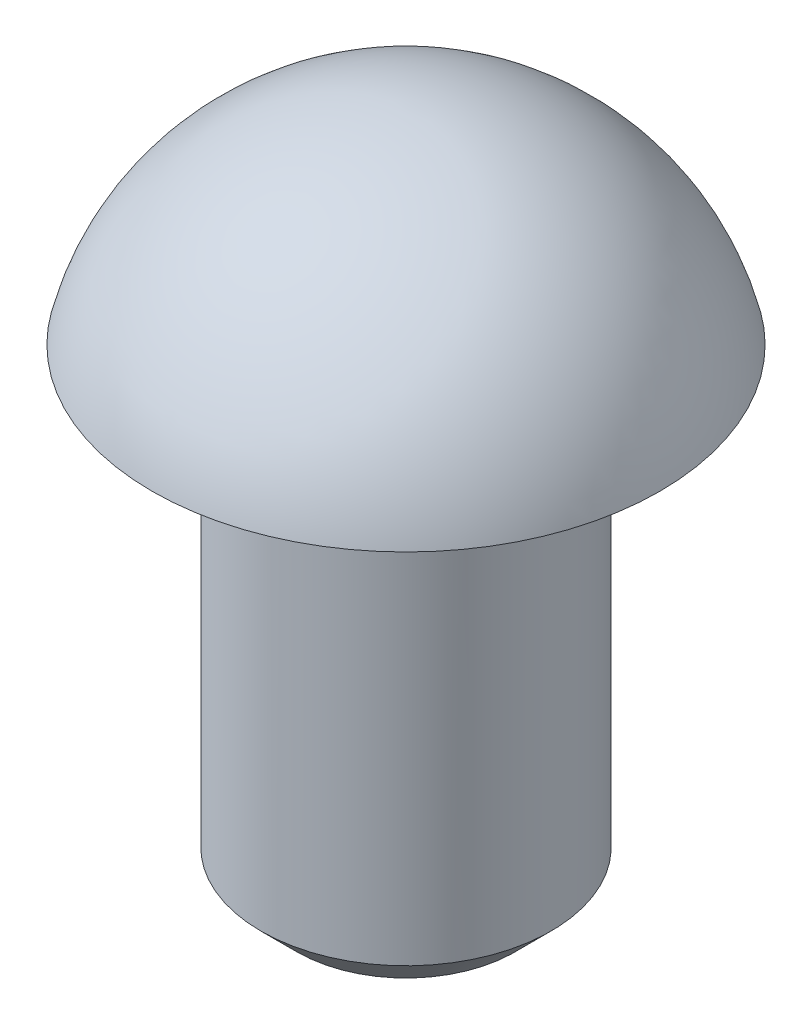
ISO-10303-21;
HEADER;
FILE_DESCRIPTION(('STEP AP214'),'2;1');
FILE_NAME('part.step','',(''),(''),'','','');
FILE_SCHEMA(('AUTOMOTIVE_DESIGN { 1 0 10303 214 1 1 1 1 }'));
ENDSEC;
DATA;
#1=APPLICATION_CONTEXT('core data for automotive mechanical design processes');
#2=APPLICATION_PROTOCOL_DEFINITION('international standard','automotive_design',2000,#1);
#3=PRODUCT_CONTEXT('',#1,'mechanical');
#4=PRODUCT('Part','Part','',(#3));
#5=PRODUCT_RELATED_PRODUCT_CATEGORY('part','',(#4));
#6=PRODUCT_DEFINITION_FORMATION('','',#4);
#7=PRODUCT_DEFINITION_CONTEXT('part definition',#1,'design');
#8=PRODUCT_DEFINITION('design','',#6,#7);
#9=PRODUCT_DEFINITION_SHAPE('','',#8);
#10=(LENGTH_UNIT() NAMED_UNIT(*) SI_UNIT(.MILLI.,.METRE.));
#11=(NAMED_UNIT(*) PLANE_ANGLE_UNIT() SI_UNIT($,.RADIAN.));
#12=(NAMED_UNIT(*) SI_UNIT($,.STERADIAN.) SOLID_ANGLE_UNIT());
#13=UNCERTAINTY_MEASURE_WITH_UNIT(LENGTH_MEASURE(1.E-05),#10,'distance_accuracy_value','');
#14=(GEOMETRIC_REPRESENTATION_CONTEXT(3) GLOBAL_UNCERTAINTY_ASSIGNED_CONTEXT((#13)) GLOBAL_UNIT_ASSIGNED_CONTEXT((#10,
#11,#12)) REPRESENTATION_CONTEXT('',''));
#15=CARTESIAN_POINT('',(0.,0.,0.));
#16=DIRECTION('',(0.,0.,1.));
#17=DIRECTION('',(1.,0.,0.));
#18=AXIS2_PLACEMENT_3D('',#15,#16,#17);
#19=CARTESIAN_POINT('',(0.,3.25,0.));
#20=DIRECTION('',(0.,-1.,0.));
#21=DIRECTION('',(0.,0.,-1.));
#22=AXIS2_PLACEMENT_3D('',#19,#20,#21);
#23=CYLINDRICAL_SURFACE('',#22,2.);
#24=CARTESIAN_POINT('',(0.,-2.75,0.));
#25=DIRECTION('',(0.,1.,0.));
#26=DIRECTION('',(0.,0.,1.));
#27=AXIS2_PLACEMENT_3D('',#24,#25,#26);
#28=CIRCLE('',#27,2.);
#29=CARTESIAN_POINT('',(0.,-2.75,-2.));
#30=VERTEX_POINT('',#29);
#31=EDGE_CURVE('E51',#30,#30,#28,.T.);
#32=CARTESIAN_POINT('',(0.,3.25,0.));
#33=DIRECTION('',(0.,1.,0.));
#34=DIRECTION('',(0.,0.,1.));
#35=AXIS2_PLACEMENT_3D('',#32,#33,#34);
#36=CIRCLE('',#35,2.);
#37=CARTESIAN_POINT('',(0.,3.25,-2.));
#38=VERTEX_POINT('',#37);
#39=EDGE_CURVE('E56',#38,#38,#36,.T.);
#40=CARTESIAN_POINT('',(0.,-2.75,-2.));
#41=CARTESIAN_POINT('',(0.,-2.6875,-2.));
#42=CARTESIAN_POINT('',(0.,-2.625,-2.));
#43=CARTESIAN_POINT('',(0.,-2.5,-2.));
#44=CARTESIAN_POINT('',(0.,-2.4375,-2.));
#45=CARTESIAN_POINT('',(0.,-2.3125,-2.));
#46=CARTESIAN_POINT('',(0.,-2.25,-2.));
#47=CARTESIAN_POINT('',(0.,-2.125,-2.));
#48=CARTESIAN_POINT('',(0.,-2.0625,-2.));
#49=CARTESIAN_POINT('',(0.,-1.9375,-2.));
#50=CARTESIAN_POINT('',(0.,-1.875,-2.));
#51=CARTESIAN_POINT('',(0.,-1.75,-2.));
#52=CARTESIAN_POINT('',(0.,-1.6875,-2.));
#53=CARTESIAN_POINT('',(0.,-1.5625,-2.));
#54=CARTESIAN_POINT('',(0.,-1.5,-2.));
#55=CARTESIAN_POINT('',(0.,-1.375,-2.));
#56=CARTESIAN_POINT('',(0.,-1.3125,-2.));
#57=CARTESIAN_POINT('',(0.,-1.1875,-2.));
#58=CARTESIAN_POINT('',(0.,-1.125,-2.));
#59=CARTESIAN_POINT('',(0.,-0.999999999999997,-2.));
#60=CARTESIAN_POINT('',(0.,-0.937499999999997,-2.));
#61=CARTESIAN_POINT('',(0.,-0.812499999999997,-2.));
#62=CARTESIAN_POINT('',(0.,-0.749999999999997,-2.));
#63=CARTESIAN_POINT('',(0.,-0.624999999999998,-2.));
#64=CARTESIAN_POINT('',(0.,-0.562499999999998,-2.));
#65=CARTESIAN_POINT('',(0.,-0.437499999999998,-2.));
#66=CARTESIAN_POINT('',(0.,-0.374999999999998,-2.));
#67=CARTESIAN_POINT('',(0.,-0.249999999999998,-2.));
#68=CARTESIAN_POINT('',(0.,-0.187499999999998,-2.));
#69=CARTESIAN_POINT('',(0.,-0.0624999999999979,-2.));
#70=CARTESIAN_POINT('',(0.,0.,-2.));
#71=CARTESIAN_POINT('',(0.,0.125000000000002,-2.));
#72=CARTESIAN_POINT('',(0.,0.187500000000002,-2.));
#73=CARTESIAN_POINT('',(0.,0.312500000000002,-2.));
#74=CARTESIAN_POINT('',(0.,0.375000000000002,-2.));
#75=CARTESIAN_POINT('',(0.,0.500000000000002,-2.));
#76=CARTESIAN_POINT('',(0.,0.562500000000002,-2.));
#77=CARTESIAN_POINT('',(0.,0.687500000000002,-2.));
#78=CARTESIAN_POINT('',(0.,0.750000000000002,-2.));
#79=CARTESIAN_POINT('',(0.,0.875000000000002,-2.));
#80=CARTESIAN_POINT('',(0.,0.937500000000002,-2.));
#81=CARTESIAN_POINT('',(0.,1.0625,-2.));
#82=CARTESIAN_POINT('',(0.,1.125,-2.));
#83=CARTESIAN_POINT('',(0.,1.25,-2.));
#84=CARTESIAN_POINT('',(0.,1.3125,-2.));
#85=CARTESIAN_POINT('',(0.,1.4375,-2.));
#86=CARTESIAN_POINT('',(0.,1.5,-2.));
#87=CARTESIAN_POINT('',(0.,1.625,-2.));
#88=CARTESIAN_POINT('',(0.,1.6875,-2.));
#89=CARTESIAN_POINT('',(0.,1.8125,-2.));
#90=CARTESIAN_POINT('',(0.,1.875,-2.));
#91=CARTESIAN_POINT('',(0.,2.,-2.));
#92=CARTESIAN_POINT('',(0.,2.0625,-2.));
#93=CARTESIAN_POINT('',(0.,2.1875,-2.));
#94=CARTESIAN_POINT('',(0.,2.25,-2.));
#95=CARTESIAN_POINT('',(0.,2.375,-2.));
#96=CARTESIAN_POINT('',(0.,2.4375,-2.));
#97=CARTESIAN_POINT('',(0.,2.5625,-2.));
#98=CARTESIAN_POINT('',(0.,2.625,-2.));
#99=CARTESIAN_POINT('',(0.,2.75,-2.));
#100=CARTESIAN_POINT('',(0.,2.8125,-2.));
#101=CARTESIAN_POINT('',(0.,2.9375,-2.));
#102=CARTESIAN_POINT('',(0.,3.,-2.));
#103=CARTESIAN_POINT('',(0.,3.125,-2.));
#104=CARTESIAN_POINT('',(0.,3.1875,-2.));
#105=CARTESIAN_POINT('',(0.,3.25,-2.));
#106=B_SPLINE_CURVE_WITH_KNOTS('',3,(#40,#41,#42,#43,#44,#45,#46,#47,#48,#49,#50,#51,#52,#53,
#54,#55,#56,#57,#58,#59,#60,#61,#62,#63,#64,#65,#66,#67,#68,#69,#70,#71,#72,#73,#74,#75,#76,#77,
#78,#79,#80,#81,#82,#83,#84,#85,#86,#87,#88,#89,#90,#91,#92,#93,#94,#95,#96,#97,#98,#99,#100,
#101,#102,#103,#104,#105),.UNSPECIFIED.,.F.,.F.,(4,2,2,2,2,2,2,2,2,2,2,2,2,2,2,2,2,2,2,2,2,2,2,
2,2,2,2,2,2,2,2,2,4),(0.,0.1875,0.374999999999999,0.5625,0.75,0.937499999999999,1.125,1.3125,
1.5,1.6875,1.875,2.0625,2.25,2.4375,2.625,2.8125,3.,3.1875,3.375,3.5625,3.75,3.9375,4.125,
4.3125,4.5,4.6875,4.875,5.0625,5.25,5.4375,5.625,5.81249999999999,5.99999999999999),.UNSPECIFIED.);
#107=EDGE_CURVE('BSEAM42',#30,#38,#106,.T.);
#108=ORIENTED_EDGE('',*,*,#31,.T.);
#109=ORIENTED_EDGE('',*,*,#39,.F.);
#110=ORIENTED_EDGE('',*,*,#107,.T.);
#111=ORIENTED_EDGE('',*,*,#107,.F.);
#112=EDGE_LOOP('',(#108,#110,#109,#111));
#113=FACE_BOUND('',#112,.T.);
#114=ADVANCED_FACE('F42',(#113),#23,.T.);
#115=CARTESIAN_POINT('',(0.,-3.25,0.));
#116=DIRECTION('',(0.,1.,0.));
#117=DIRECTION('',(0.,0.,1.));
#118=AXIS2_PLACEMENT_3D('',#115,#116,#117);
#119=PLANE('',#118);
#120=CARTESIAN_POINT('',(0.,-3.25,0.));
#121=DIRECTION('',(0.,1.,0.));
#122=DIRECTION('',(0.,0.,1.));
#123=AXIS2_PLACEMENT_3D('',#120,#121,#122);
#124=CIRCLE('',#123,1.49999999999999);
#125=CARTESIAN_POINT('',(0.,-3.25,1.49999999999999));
#126=VERTEX_POINT('',#125);
#127=EDGE_CURVE('E10',#126,#126,#124,.F.);
#128=ORIENTED_EDGE('',*,*,#127,.T.);
#129=EDGE_LOOP('',(#128));
#130=FACE_BOUND('',#129,.T.);
#131=ADVANCED_FACE('F79',(#130),#119,.F.);
#132=CARTESIAN_POINT('',(0.,-2.75,0.));
#133=DIRECTION('',(0.,1.,0.));
#134=DIRECTION('',(0.,0.,1.));
#135=AXIS2_PLACEMENT_3D('',#132,#133,#134);
#136=CONICAL_SURFACE('',#135,2.,0.78539816339745);
#137=ORIENTED_EDGE('',*,*,#127,.F.);
#138=EDGE_LOOP('',(#137));
#139=FACE_BOUND('',#138,.T.);
#140=ORIENTED_EDGE('',*,*,#31,.F.);
#141=EDGE_LOOP('',(#140));
#142=FACE_BOUND('',#141,.T.);
#143=ADVANCED_FACE('F45',(#139,#142),#136,.T.);
#144=CARTESIAN_POINT('',(0.,2.40738502268236,0.));
#145=DIRECTION('',(0.,-1.,0.));
#146=DIRECTION('',(0.,0.,1.));
#147=AXIS2_PLACEMENT_3D('',#144,#145,#146);
#148=SPHERICAL_SURFACE('',#147,3.6);
#149=CARTESIAN_POINT('',(0.,3.25,0.));
#150=DIRECTION('',(0.,-1.,0.));
#151=DIRECTION('',(0.,0.,-1.));
#152=AXIS2_PLACEMENT_3D('',#149,#150,#151);
#153=CIRCLE('',#152,3.5);
#154=CARTESIAN_POINT('',(0.,3.25,-3.5));
#155=VERTEX_POINT('',#154);
#156=EDGE_CURVE('E61',#155,#155,#153,.T.);
#157=ORIENTED_EDGE('',*,*,#156,.F.);
#158=EDGE_LOOP('',(#157));
#159=FACE_BOUND('',#158,.T.);
#160=ADVANCED_FACE('F70',(#159),#148,.T.);
#161=CARTESIAN_POINT('',(0.,3.25,0.));
#162=DIRECTION('',(0.,1.,0.));
#163=DIRECTION('',(0.,0.,1.));
#164=AXIS2_PLACEMENT_3D('',#161,#162,#163);
#165=PLANE('',#164);
#166=ORIENTED_EDGE('',*,*,#39,.T.);
#167=EDGE_LOOP('',(#166));
#168=FACE_BOUND('',#167,.T.);
#169=ORIENTED_EDGE('',*,*,#156,.T.);
#170=EDGE_LOOP('',(#169));
#171=FACE_BOUND('',#170,.T.);
#172=ADVANCED_FACE('F68',(#168,#171),#165,.F.);
#173=CLOSED_SHELL('',(#114,#131,#143,#160,#172));
#174=MANIFOLD_SOLID_BREP('B2',#173);
#175=ADVANCED_BREP_SHAPE_REPRESENTATION('',(#18,#174),#14);
#176=SHAPE_DEFINITION_REPRESENTATION(#9,#175);
ENDSEC;
END-ISO-10303-21;
